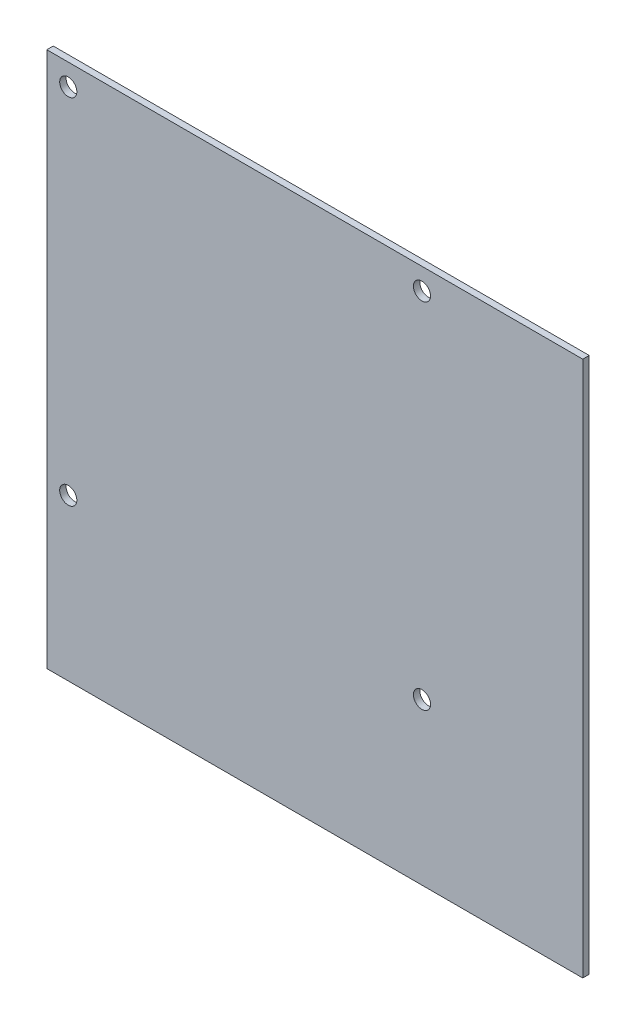
ISO-10303-21;
HEADER;
FILE_DESCRIPTION(('STEP AP214'),'2;1');
FILE_NAME('part.step','',(''),(''),'','','');
FILE_SCHEMA(('AUTOMOTIVE_DESIGN { 1 0 10303 214 1 1 1 1 }'));
ENDSEC;
DATA;
#1=APPLICATION_CONTEXT('core data for automotive mechanical design processes');
#2=APPLICATION_PROTOCOL_DEFINITION('international standard','automotive_design',2000,#1);
#3=PRODUCT_CONTEXT('',#1,'mechanical');
#4=PRODUCT('Part','Part','',(#3));
#5=PRODUCT_RELATED_PRODUCT_CATEGORY('part','',(#4));
#6=PRODUCT_DEFINITION_FORMATION('','',#4);
#7=PRODUCT_DEFINITION_CONTEXT('part definition',#1,'design');
#8=PRODUCT_DEFINITION('design','',#6,#7);
#9=PRODUCT_DEFINITION_SHAPE('','',#8);
#10=(LENGTH_UNIT() NAMED_UNIT(*) SI_UNIT(.MILLI.,.METRE.));
#11=(NAMED_UNIT(*) PLANE_ANGLE_UNIT() SI_UNIT($,.RADIAN.));
#12=(NAMED_UNIT(*) SI_UNIT($,.STERADIAN.) SOLID_ANGLE_UNIT());
#13=UNCERTAINTY_MEASURE_WITH_UNIT(LENGTH_MEASURE(1.E-05),#10,'distance_accuracy_value','');
#14=(GEOMETRIC_REPRESENTATION_CONTEXT(3) GLOBAL_UNCERTAINTY_ASSIGNED_CONTEXT((#13)) GLOBAL_UNIT_ASSIGNED_CONTEXT((#10,
#11,#12)) REPRESENTATION_CONTEXT('',''));
#15=CARTESIAN_POINT('',(0.,0.,0.));
#16=DIRECTION('',(0.,0.,1.));
#17=DIRECTION('',(1.,0.,0.));
#18=AXIS2_PLACEMENT_3D('',#15,#16,#17);
#19=CARTESIAN_POINT('',(125.,125.,2.99999999999989));
#20=DIRECTION('',(-1.,0.,0.));
#21=DIRECTION('',(0.,-1.,0.));
#22=AXIS2_PLACEMENT_3D('',#19,#20,#21);
#23=PLANE('',#22);
#24=DIRECTION('',(0.,1.,0.));
#25=VECTOR('',#24,1.);
#26=CARTESIAN_POINT('',(125.,125.,-1.11022302462516E-13));
#27=LINE('',#26,#25);
#28=CARTESIAN_POINT('',(125.,-125.,0.));
#29=VERTEX_POINT('',#28);
#30=CARTESIAN_POINT('',(125.,125.,-1.11022302462516E-13));
#31=VERTEX_POINT('',#30);
#32=EDGE_CURVE('E110',#29,#31,#27,.T.);
#33=ORIENTED_EDGE('',*,*,#32,.T.);
#34=DIRECTION('',(0.,0.,-1.));
#35=VECTOR('',#34,1.);
#36=CARTESIAN_POINT('',(125.,125.,2.99999999999989));
#37=LINE('',#36,#35);
#38=CARTESIAN_POINT('',(125.,125.,2.99999999999989));
#39=VERTEX_POINT('',#38);
#40=EDGE_CURVE('E13',#39,#31,#37,.T.);
#41=ORIENTED_EDGE('',*,*,#40,.F.);
#42=DIRECTION('',(0.,1.,0.));
#43=VECTOR('',#42,1.);
#44=CARTESIAN_POINT('',(125.,125.,2.99999999999989));
#45=LINE('',#44,#43);
#46=CARTESIAN_POINT('',(125.,-125.,2.99999999999995));
#47=VERTEX_POINT('',#46);
#48=EDGE_CURVE('E98',#47,#39,#45,.T.);
#49=ORIENTED_EDGE('',*,*,#48,.F.);
#50=DIRECTION('',(0.,0.,-1.));
#51=VECTOR('',#50,1.);
#52=CARTESIAN_POINT('',(125.,-125.,2.99999999999995));
#53=LINE('',#52,#51);
#54=EDGE_CURVE('E106',#47,#29,#53,.T.);
#55=ORIENTED_EDGE('',*,*,#54,.T.);
#56=EDGE_LOOP('',(#33,#41,#49,#55));
#57=FACE_BOUND('',#56,.T.);
#58=ADVANCED_FACE('F47',(#57),#23,.F.);
#59=CARTESIAN_POINT('',(-125.,125.,2.99999999999978));
#60=DIRECTION('',(0.,-1.,0.));
#61=DIRECTION('',(0.,0.,-1.));
#62=AXIS2_PLACEMENT_3D('',#59,#60,#61);
#63=PLANE('',#62);
#64=DIRECTION('',(-1.,0.,0.));
#65=VECTOR('',#64,1.);
#66=CARTESIAN_POINT('',(-125.,125.,-2.22044604925031E-13));
#67=LINE('',#66,#65);
#68=CARTESIAN_POINT('',(-125.,125.,-2.22044604925031E-13));
#69=VERTEX_POINT('',#68);
#70=EDGE_CURVE('E102',#31,#69,#67,.T.);
#71=ORIENTED_EDGE('',*,*,#70,.T.);
#72=DIRECTION('',(0.,0.,-1.));
#73=VECTOR('',#72,1.);
#74=CARTESIAN_POINT('',(-125.,125.,2.99999999999978));
#75=LINE('',#74,#73);
#76=CARTESIAN_POINT('',(-125.,125.,2.99999999999978));
#77=VERTEX_POINT('',#76);
#78=EDGE_CURVE('E55',#77,#69,#75,.T.);
#79=ORIENTED_EDGE('',*,*,#78,.F.);
#80=DIRECTION('',(-1.,0.,0.));
#81=VECTOR('',#80,1.);
#82=CARTESIAN_POINT('',(-125.,125.,2.99999999999978));
#83=LINE('',#82,#81);
#84=EDGE_CURVE('E93',#39,#77,#83,.T.);
#85=ORIENTED_EDGE('',*,*,#84,.F.);
#86=ORIENTED_EDGE('',*,*,#40,.T.);
#87=EDGE_LOOP('',(#71,#79,#85,#86));
#88=FACE_BOUND('',#87,.T.);
#89=ADVANCED_FACE('F101',(#88),#63,.F.);
#90=CARTESIAN_POINT('',(-125.,125.,2.99999999999978));
#91=DIRECTION('',(1.,0.,0.));
#92=DIRECTION('',(0.,1.,0.));
#93=AXIS2_PLACEMENT_3D('',#90,#91,#92);
#94=PLANE('',#93);
#95=DIRECTION('',(0.,-1.,0.));
#96=VECTOR('',#95,1.);
#97=CARTESIAN_POINT('',(-125.,125.,-2.22044604925031E-13));
#98=LINE('',#97,#96);
#99=CARTESIAN_POINT('',(-125.,-125.,-1.66533453693773E-13));
#100=VERTEX_POINT('',#99);
#101=EDGE_CURVE('E80',#69,#100,#98,.T.);
#102=ORIENTED_EDGE('',*,*,#101,.T.);
#103=DIRECTION('',(0.,0.,-1.));
#104=VECTOR('',#103,1.);
#105=CARTESIAN_POINT('',(-125.,-125.,2.99999999999984));
#106=LINE('',#105,#104);
#107=CARTESIAN_POINT('',(-125.,-125.,2.99999999999984));
#108=VERTEX_POINT('',#107);
#109=EDGE_CURVE('E103',#108,#100,#106,.T.);
#110=ORIENTED_EDGE('',*,*,#109,.F.);
#111=DIRECTION('',(0.,-1.,0.));
#112=VECTOR('',#111,1.);
#113=CARTESIAN_POINT('',(-125.,125.,2.99999999999978));
#114=LINE('',#113,#112);
#115=EDGE_CURVE('E96',#77,#108,#114,.T.);
#116=ORIENTED_EDGE('',*,*,#115,.F.);
#117=ORIENTED_EDGE('',*,*,#78,.T.);
#118=EDGE_LOOP('',(#102,#110,#116,#117));
#119=FACE_BOUND('',#118,.T.);
#120=ADVANCED_FACE('F104',(#119),#94,.F.);
#121=CARTESIAN_POINT('',(-125.,-125.,2.99999999999984));
#122=DIRECTION('',(0.,1.,0.));
#123=DIRECTION('',(0.,0.,1.));
#124=AXIS2_PLACEMENT_3D('',#121,#122,#123);
#125=PLANE('',#124);
#126=DIRECTION('',(1.,0.,0.));
#127=VECTOR('',#126,1.);
#128=CARTESIAN_POINT('',(-125.,-125.,-1.66533453693773E-13));
#129=LINE('',#128,#127);
#130=EDGE_CURVE('E86',#100,#29,#129,.T.);
#131=ORIENTED_EDGE('',*,*,#130,.T.);
#132=ORIENTED_EDGE('',*,*,#54,.F.);
#133=DIRECTION('',(1.,0.,0.));
#134=VECTOR('',#133,1.);
#135=CARTESIAN_POINT('',(-125.,-125.,2.99999999999984));
#136=LINE('',#135,#134);
#137=EDGE_CURVE('E63',#108,#47,#136,.T.);
#138=ORIENTED_EDGE('',*,*,#137,.F.);
#139=ORIENTED_EDGE('',*,*,#109,.T.);
#140=EDGE_LOOP('',(#131,#132,#138,#139));
#141=FACE_BOUND('',#140,.T.);
#142=ADVANCED_FACE('F118',(#141),#125,.F.);
#143=CARTESIAN_POINT('',(0.,0.,3.));
#144=DIRECTION('',(0.,0.,1.));
#145=DIRECTION('',(1.,0.,0.));
#146=AXIS2_PLACEMENT_3D('',#143,#144,#145);
#147=PLANE('',#146);
#148=CARTESIAN_POINT('',(50.,115.,2.99999999999989));
#149=DIRECTION('',(0.,0.,1.));
#150=DIRECTION('',(1.,0.,0.));
#151=AXIS2_PLACEMENT_3D('',#148,#149,#150);
#152=CIRCLE('',#151,4.00000000000001);
#153=CARTESIAN_POINT('',(54.,115.,2.99999999999989));
#154=VERTEX_POINT('',#153);
#155=EDGE_CURVE('E137',#154,#154,#152,.T.);
#156=ORIENTED_EDGE('',*,*,#155,.F.);
#157=EDGE_LOOP('',(#156));
#158=FACE_BOUND('',#157,.T.);
#159=CARTESIAN_POINT('',(-115.,-50.,2.99999999999995));
#160=DIRECTION('',(0.,0.,1.));
#161=DIRECTION('',(1.,0.,0.));
#162=AXIS2_PLACEMENT_3D('',#159,#160,#161);
#163=CIRCLE('',#162,4.00000000000001);
#164=CARTESIAN_POINT('',(-111.,-50.,2.99999999999995));
#165=VERTEX_POINT('',#164);
#166=EDGE_CURVE('E130',#165,#165,#163,.T.);
#167=ORIENTED_EDGE('',*,*,#166,.F.);
#168=EDGE_LOOP('',(#167));
#169=FACE_BOUND('',#168,.T.);
#170=CARTESIAN_POINT('',(50.,-50.,2.99999999999989));
#171=DIRECTION('',(0.,0.,1.));
#172=DIRECTION('',(1.,0.,0.));
#173=AXIS2_PLACEMENT_3D('',#170,#171,#172);
#174=CIRCLE('',#173,4.00000000000001);
#175=CARTESIAN_POINT('',(54.,-50.,2.99999999999989));
#176=VERTEX_POINT('',#175);
#177=EDGE_CURVE('E142',#176,#176,#174,.T.);
#178=ORIENTED_EDGE('',*,*,#177,.F.);
#179=EDGE_LOOP('',(#178));
#180=FACE_BOUND('',#179,.T.);
#181=CARTESIAN_POINT('',(-115.,115.,2.99999999999995));
#182=DIRECTION('',(0.,0.,1.));
#183=DIRECTION('',(1.,0.,0.));
#184=AXIS2_PLACEMENT_3D('',#181,#182,#183);
#185=CIRCLE('',#184,4.00000000000001);
#186=CARTESIAN_POINT('',(-111.,115.,2.99999999999995));
#187=VERTEX_POINT('',#186);
#188=EDGE_CURVE('E124',#187,#187,#185,.T.);
#189=ORIENTED_EDGE('',*,*,#188,.F.);
#190=EDGE_LOOP('',(#189));
#191=FACE_BOUND('',#190,.T.);
#192=ORIENTED_EDGE('',*,*,#48,.T.);
#193=ORIENTED_EDGE('',*,*,#84,.T.);
#194=ORIENTED_EDGE('',*,*,#115,.T.);
#195=ORIENTED_EDGE('',*,*,#137,.T.);
#196=EDGE_LOOP('',(#192,#193,#194,#195));
#197=FACE_BOUND('',#196,.T.);
#198=ADVANCED_FACE('F94',(#158,#169,#180,#191,#197),#147,.T.);
#199=CARTESIAN_POINT('',(0.,0.,0.));
#200=DIRECTION('',(0.,0.,1.));
#201=DIRECTION('',(1.,0.,0.));
#202=AXIS2_PLACEMENT_3D('',#199,#200,#201);
#203=PLANE('',#202);
#204=CARTESIAN_POINT('',(50.,115.,-1.11022302462516E-13));
#205=DIRECTION('',(0.,0.,1.));
#206=DIRECTION('',(1.,0.,0.));
#207=AXIS2_PLACEMENT_3D('',#204,#205,#206);
#208=CIRCLE('',#207,4.00000000000001);
#209=CARTESIAN_POINT('',(54.,115.,-1.11022302468927E-13));
#210=VERTEX_POINT('',#209);
#211=EDGE_CURVE('E127',#210,#210,#208,.T.);
#212=ORIENTED_EDGE('',*,*,#211,.T.);
#213=EDGE_LOOP('',(#212));
#214=FACE_BOUND('',#213,.T.);
#215=CARTESIAN_POINT('',(-115.,-50.,0.));
#216=DIRECTION('',(0.,0.,1.));
#217=DIRECTION('',(1.,0.,0.));
#218=AXIS2_PLACEMENT_3D('',#215,#216,#217);
#219=CIRCLE('',#218,4.00000000000001);
#220=CARTESIAN_POINT('',(-111.,-50.,0.));
#221=VERTEX_POINT('',#220);
#222=EDGE_CURVE('E133',#221,#221,#219,.T.);
#223=ORIENTED_EDGE('',*,*,#222,.T.);
#224=EDGE_LOOP('',(#223));
#225=FACE_BOUND('',#224,.T.);
#226=CARTESIAN_POINT('',(50.,-50.,-1.11022302462516E-13));
#227=DIRECTION('',(0.,0.,1.));
#228=DIRECTION('',(1.,0.,0.));
#229=AXIS2_PLACEMENT_3D('',#226,#227,#228);
#230=CIRCLE('',#229,4.00000000000001);
#231=CARTESIAN_POINT('',(54.,-50.,-1.11022302468927E-13));
#232=VERTEX_POINT('',#231);
#233=EDGE_CURVE('E134',#232,#232,#230,.T.);
#234=ORIENTED_EDGE('',*,*,#233,.T.);
#235=EDGE_LOOP('',(#234));
#236=FACE_BOUND('',#235,.T.);
#237=CARTESIAN_POINT('',(-115.,115.,0.));
#238=DIRECTION('',(0.,0.,1.));
#239=DIRECTION('',(1.,0.,0.));
#240=AXIS2_PLACEMENT_3D('',#237,#238,#239);
#241=CIRCLE('',#240,4.00000000000001);
#242=CARTESIAN_POINT('',(-111.,115.,0.));
#243=VERTEX_POINT('',#242);
#244=EDGE_CURVE('E113',#243,#243,#241,.T.);
#245=ORIENTED_EDGE('',*,*,#244,.T.);
#246=EDGE_LOOP('',(#245));
#247=FACE_BOUND('',#246,.T.);
#248=ORIENTED_EDGE('',*,*,#32,.F.);
#249=ORIENTED_EDGE('',*,*,#130,.F.);
#250=ORIENTED_EDGE('',*,*,#101,.F.);
#251=ORIENTED_EDGE('',*,*,#70,.F.);
#252=EDGE_LOOP('',(#248,#249,#250,#251));
#253=FACE_BOUND('',#252,.T.);
#254=ADVANCED_FACE('F121',(#214,#225,#236,#247,#253),#203,.F.);
#255=CARTESIAN_POINT('',(-115.,115.,0.));
#256=DIRECTION('',(0.,0.,1.));
#257=DIRECTION('',(1.,0.,0.));
#258=AXIS2_PLACEMENT_3D('',#255,#256,#257);
#259=CYLINDRICAL_SURFACE('',#258,4.00000000000001);
#260=CARTESIAN_POINT('',(-111.,115.,0.));
#261=CARTESIAN_POINT('',(-111.,115.,0.0312499999999446));
#262=CARTESIAN_POINT('',(-111.,115.,0.0624999999999446));
#263=CARTESIAN_POINT('',(-111.,115.,0.124999999999945));
#264=CARTESIAN_POINT('',(-111.,115.,0.156249999999945));
#265=CARTESIAN_POINT('',(-111.,115.,0.218749999999945));
#266=CARTESIAN_POINT('',(-111.,115.,0.249999999999945));
#267=CARTESIAN_POINT('',(-111.,115.,0.312499999999945));
#268=CARTESIAN_POINT('',(-111.,115.,0.343749999999945));
#269=CARTESIAN_POINT('',(-111.,115.,0.406249999999945));
#270=CARTESIAN_POINT('',(-111.,115.,0.437499999999945));
#271=CARTESIAN_POINT('',(-111.,115.,0.499999999999945));
#272=CARTESIAN_POINT('',(-111.,115.,0.531249999999945));
#273=CARTESIAN_POINT('',(-111.,115.,0.593749999999945));
#274=CARTESIAN_POINT('',(-111.,115.,0.624999999999945));
#275=CARTESIAN_POINT('',(-111.,115.,0.687499999999945));
#276=CARTESIAN_POINT('',(-111.,115.,0.718749999999945));
#277=CARTESIAN_POINT('',(-111.,115.,0.781249999999945));
#278=CARTESIAN_POINT('',(-111.,115.,0.812499999999945));
#279=CARTESIAN_POINT('',(-111.,115.,0.874999999999945));
#280=CARTESIAN_POINT('',(-111.,115.,0.906249999999945));
#281=CARTESIAN_POINT('',(-111.,115.,0.968749999999945));
#282=CARTESIAN_POINT('',(-111.,115.,0.999999999999945));
#283=CARTESIAN_POINT('',(-111.,115.,1.06249999999995));
#284=CARTESIAN_POINT('',(-111.,115.,1.09374999999995));
#285=CARTESIAN_POINT('',(-111.,115.,1.15624999999995));
#286=CARTESIAN_POINT('',(-111.,115.,1.18749999999995));
#287=CARTESIAN_POINT('',(-111.,115.,1.24999999999995));
#288=CARTESIAN_POINT('',(-111.,115.,1.28124999999995));
#289=CARTESIAN_POINT('',(-111.,115.,1.34374999999995));
#290=CARTESIAN_POINT('',(-111.,115.,1.37499999999995));
#291=CARTESIAN_POINT('',(-111.,115.,1.43749999999995));
#292=CARTESIAN_POINT('',(-111.,115.,1.46874999999995));
#293=CARTESIAN_POINT('',(-111.,115.,1.53124999999995));
#294=CARTESIAN_POINT('',(-111.,115.,1.56249999999995));
#295=CARTESIAN_POINT('',(-111.,115.,1.62499999999995));
#296=CARTESIAN_POINT('',(-111.,115.,1.65624999999995));
#297=CARTESIAN_POINT('',(-111.,115.,1.71874999999995));
#298=CARTESIAN_POINT('',(-111.,115.,1.74999999999995));
#299=CARTESIAN_POINT('',(-111.,115.,1.81249999999995));
#300=CARTESIAN_POINT('',(-111.,115.,1.84374999999995));
#301=CARTESIAN_POINT('',(-111.,115.,1.90624999999995));
#302=CARTESIAN_POINT('',(-111.,115.,1.93749999999995));
#303=CARTESIAN_POINT('',(-111.,115.,1.99999999999995));
#304=CARTESIAN_POINT('',(-111.,115.,2.03124999999995));
#305=CARTESIAN_POINT('',(-111.,115.,2.09374999999995));
#306=CARTESIAN_POINT('',(-111.,115.,2.12499999999995));
#307=CARTESIAN_POINT('',(-111.,115.,2.18749999999995));
#308=CARTESIAN_POINT('',(-111.,115.,2.21874999999995));
#309=CARTESIAN_POINT('',(-111.,115.,2.28124999999995));
#310=CARTESIAN_POINT('',(-111.,115.,2.31249999999995));
#311=CARTESIAN_POINT('',(-111.,115.,2.37499999999995));
#312=CARTESIAN_POINT('',(-111.,115.,2.40624999999995));
#313=CARTESIAN_POINT('',(-111.,115.,2.46874999999995));
#314=CARTESIAN_POINT('',(-111.,115.,2.49999999999995));
#315=CARTESIAN_POINT('',(-111.,115.,2.56249999999995));
#316=CARTESIAN_POINT('',(-111.,115.,2.59374999999995));
#317=CARTESIAN_POINT('',(-111.,115.,2.65624999999995));
#318=CARTESIAN_POINT('',(-111.,115.,2.68749999999995));
#319=CARTESIAN_POINT('',(-111.,115.,2.74999999999995));
#320=CARTESIAN_POINT('',(-111.,115.,2.78124999999995));
#321=CARTESIAN_POINT('',(-111.,115.,2.84374999999995));
#322=CARTESIAN_POINT('',(-111.,115.,2.87499999999995));
#323=CARTESIAN_POINT('',(-111.,115.,2.93749999999995));
#324=CARTESIAN_POINT('',(-111.,115.,2.96874999999995));
#325=CARTESIAN_POINT('',(-111.,115.,2.99999999999995));
#326=B_SPLINE_CURVE_WITH_KNOTS('',3,(#260,#261,#262,#263,#264,#265,#266,#267,#268,#269,#270,
#271,#272,#273,#274,#275,#276,#277,#278,#279,#280,#281,#282,#283,#284,#285,#286,#287,#288,#289,
#290,#291,#292,#293,#294,#295,#296,#297,#298,#299,#300,#301,#302,#303,#304,#305,#306,#307,#308,
#309,#310,#311,#312,#313,#314,#315,#316,#317,#318,#319,#320,#321,#322,#323,#324,#325),
.UNSPECIFIED.,.F.,.F.,(4,2,2,2,2,2,2,2,2,2,2,2,2,2,2,2,2,2,2,2,2,2,2,2,2,2,2,2,2,2,2,2,4),(0.,
0.0937500000000001,0.1875,0.28125,0.375,0.46875,0.5625,0.65625,0.750000000000001,
0.843750000000001,0.937500000000001,1.03125,1.125,1.21875,1.3125,1.40625,1.5,1.59375,1.6875,
1.78125,1.875,1.96875,2.0625,2.15625,2.25,2.34375,2.4375,2.53125,2.625,2.71875,2.8125,2.90625,
3.),.UNSPECIFIED.);
#327=EDGE_CURVE('BSEAM154',#243,#187,#326,.T.);
#328=ORIENTED_EDGE('',*,*,#244,.F.);
#329=ORIENTED_EDGE('',*,*,#188,.T.);
#330=ORIENTED_EDGE('',*,*,#327,.T.);
#331=ORIENTED_EDGE('',*,*,#327,.F.);
#332=EDGE_LOOP('',(#328,#330,#329,#331));
#333=FACE_BOUND('',#332,.T.);
#334=ADVANCED_FACE('F154',(#333),#259,.F.);
#335=CARTESIAN_POINT('',(50.,-50.,-1.11022302462516E-13));
#336=DIRECTION('',(0.,0.,1.));
#337=DIRECTION('',(1.,0.,0.));
#338=AXIS2_PLACEMENT_3D('',#335,#336,#337);
#339=CYLINDRICAL_SURFACE('',#338,4.00000000000001);
#340=CARTESIAN_POINT('',(54.,-50.,-1.11022302468927E-13));
#341=CARTESIAN_POINT('',(54.,-50.,0.031249999999889));
#342=CARTESIAN_POINT('',(54.,-50.,0.062499999999889));
#343=CARTESIAN_POINT('',(54.,-50.,0.124999999999889));
#344=CARTESIAN_POINT('',(54.,-50.,0.156249999999889));
#345=CARTESIAN_POINT('',(54.,-50.,0.218749999999889));
#346=CARTESIAN_POINT('',(54.,-50.,0.249999999999889));
#347=CARTESIAN_POINT('',(54.,-50.,0.312499999999889));
#348=CARTESIAN_POINT('',(54.,-50.,0.343749999999889));
#349=CARTESIAN_POINT('',(54.,-50.,0.406249999999889));
#350=CARTESIAN_POINT('',(54.,-50.,0.437499999999889));
#351=CARTESIAN_POINT('',(54.,-50.,0.499999999999889));
#352=CARTESIAN_POINT('',(54.,-50.,0.531249999999889));
#353=CARTESIAN_POINT('',(54.,-50.,0.59374999999989));
#354=CARTESIAN_POINT('',(54.,-50.,0.624999999999889));
#355=CARTESIAN_POINT('',(54.,-50.,0.68749999999989));
#356=CARTESIAN_POINT('',(54.,-50.,0.71874999999989));
#357=CARTESIAN_POINT('',(54.,-50.,0.78124999999989));
#358=CARTESIAN_POINT('',(54.,-50.,0.81249999999989));
#359=CARTESIAN_POINT('',(54.,-50.,0.87499999999989));
#360=CARTESIAN_POINT('',(54.,-50.,0.90624999999989));
#361=CARTESIAN_POINT('',(54.,-50.,0.96874999999989));
#362=CARTESIAN_POINT('',(54.,-50.,0.99999999999989));
#363=CARTESIAN_POINT('',(54.,-50.,1.06249999999989));
#364=CARTESIAN_POINT('',(54.,-50.,1.09374999999989));
#365=CARTESIAN_POINT('',(54.,-50.,1.15624999999989));
#366=CARTESIAN_POINT('',(54.,-50.,1.18749999999989));
#367=CARTESIAN_POINT('',(54.,-50.,1.24999999999989));
#368=CARTESIAN_POINT('',(54.,-50.,1.28124999999989));
#369=CARTESIAN_POINT('',(54.,-50.,1.34374999999989));
#370=CARTESIAN_POINT('',(54.,-50.,1.37499999999989));
#371=CARTESIAN_POINT('',(54.,-50.,1.43749999999989));
#372=CARTESIAN_POINT('',(54.,-50.,1.46874999999989));
#373=CARTESIAN_POINT('',(54.,-50.,1.53124999999989));
#374=CARTESIAN_POINT('',(54.,-50.,1.56249999999989));
#375=CARTESIAN_POINT('',(54.,-50.,1.62499999999989));
#376=CARTESIAN_POINT('',(54.,-50.,1.65624999999989));
#377=CARTESIAN_POINT('',(54.,-50.,1.71874999999989));
#378=CARTESIAN_POINT('',(54.,-50.,1.74999999999989));
#379=CARTESIAN_POINT('',(54.,-50.,1.81249999999989));
#380=CARTESIAN_POINT('',(54.,-50.,1.84374999999989));
#381=CARTESIAN_POINT('',(54.,-50.,1.90624999999989));
#382=CARTESIAN_POINT('',(54.,-50.,1.93749999999989));
#383=CARTESIAN_POINT('',(54.,-50.,1.99999999999989));
#384=CARTESIAN_POINT('',(54.,-50.,2.03124999999989));
#385=CARTESIAN_POINT('',(54.,-50.,2.09374999999989));
#386=CARTESIAN_POINT('',(54.,-50.,2.12499999999989));
#387=CARTESIAN_POINT('',(54.,-50.,2.18749999999989));
#388=CARTESIAN_POINT('',(54.,-50.,2.21874999999989));
#389=CARTESIAN_POINT('',(54.,-50.,2.28124999999989));
#390=CARTESIAN_POINT('',(54.,-50.,2.31249999999989));
#391=CARTESIAN_POINT('',(54.,-50.,2.37499999999989));
#392=CARTESIAN_POINT('',(54.,-50.,2.40624999999989));
#393=CARTESIAN_POINT('',(54.,-50.,2.46874999999989));
#394=CARTESIAN_POINT('',(54.,-50.,2.49999999999989));
#395=CARTESIAN_POINT('',(54.,-50.,2.56249999999989));
#396=CARTESIAN_POINT('',(54.,-50.,2.59374999999989));
#397=CARTESIAN_POINT('',(54.,-50.,2.65624999999989));
#398=CARTESIAN_POINT('',(54.,-50.,2.68749999999989));
#399=CARTESIAN_POINT('',(54.,-50.,2.74999999999989));
#400=CARTESIAN_POINT('',(54.,-50.,2.78124999999989));
#401=CARTESIAN_POINT('',(54.,-50.,2.84374999999989));
#402=CARTESIAN_POINT('',(54.,-50.,2.87499999999989));
#403=CARTESIAN_POINT('',(54.,-50.,2.93749999999989));
#404=CARTESIAN_POINT('',(54.,-50.,2.96874999999989));
#405=CARTESIAN_POINT('',(54.,-50.,2.99999999999989));
#406=B_SPLINE_CURVE_WITH_KNOTS('',3,(#340,#341,#342,#343,#344,#345,#346,#347,#348,#349,#350,
#351,#352,#353,#354,#355,#356,#357,#358,#359,#360,#361,#362,#363,#364,#365,#366,#367,#368,#369,
#370,#371,#372,#373,#374,#375,#376,#377,#378,#379,#380,#381,#382,#383,#384,#385,#386,#387,#388,
#389,#390,#391,#392,#393,#394,#395,#396,#397,#398,#399,#400,#401,#402,#403,#404,#405),
.UNSPECIFIED.,.F.,.F.,(4,2,2,2,2,2,2,2,2,2,2,2,2,2,2,2,2,2,2,2,2,2,2,2,2,2,2,2,2,2,2,2,4),(0.,
0.0937500000000001,0.1875,0.28125,0.375,0.46875,0.5625,0.65625,0.750000000000001,
0.843750000000001,0.937500000000001,1.03125,1.125,1.21875,1.3125,1.40625,1.5,1.59375,1.6875,
1.78125,1.875,1.96875,2.0625,2.15625,2.25,2.34375,2.4375,2.53125,2.625,2.71875,2.8125,2.90625,
3.),.UNSPECIFIED.);
#407=EDGE_CURVE('BSEAM150',#232,#176,#406,.T.);
#408=ORIENTED_EDGE('',*,*,#233,.F.);
#409=ORIENTED_EDGE('',*,*,#177,.T.);
#410=ORIENTED_EDGE('',*,*,#407,.T.);
#411=ORIENTED_EDGE('',*,*,#407,.F.);
#412=EDGE_LOOP('',(#408,#410,#409,#411));
#413=FACE_BOUND('',#412,.T.);
#414=ADVANCED_FACE('F150',(#413),#339,.F.);
#415=CARTESIAN_POINT('',(-115.,-50.,0.));
#416=DIRECTION('',(0.,0.,1.));
#417=DIRECTION('',(1.,0.,0.));
#418=AXIS2_PLACEMENT_3D('',#415,#416,#417);
#419=CYLINDRICAL_SURFACE('',#418,4.00000000000001);
#420=CARTESIAN_POINT('',(-111.,-50.,0.));
#421=CARTESIAN_POINT('',(-111.,-50.,0.0312499999999446));
#422=CARTESIAN_POINT('',(-111.,-50.,0.0624999999999446));
#423=CARTESIAN_POINT('',(-111.,-50.,0.124999999999945));
#424=CARTESIAN_POINT('',(-111.,-50.,0.156249999999945));
#425=CARTESIAN_POINT('',(-111.,-50.,0.218749999999945));
#426=CARTESIAN_POINT('',(-111.,-50.,0.249999999999945));
#427=CARTESIAN_POINT('',(-111.,-50.,0.312499999999945));
#428=CARTESIAN_POINT('',(-111.,-50.,0.343749999999945));
#429=CARTESIAN_POINT('',(-111.,-50.,0.406249999999945));
#430=CARTESIAN_POINT('',(-111.,-50.,0.437499999999945));
#431=CARTESIAN_POINT('',(-111.,-50.,0.499999999999945));
#432=CARTESIAN_POINT('',(-111.,-50.,0.531249999999945));
#433=CARTESIAN_POINT('',(-111.,-50.,0.593749999999945));
#434=CARTESIAN_POINT('',(-111.,-50.,0.624999999999945));
#435=CARTESIAN_POINT('',(-111.,-50.,0.687499999999945));
#436=CARTESIAN_POINT('',(-111.,-50.,0.718749999999945));
#437=CARTESIAN_POINT('',(-111.,-50.,0.781249999999945));
#438=CARTESIAN_POINT('',(-111.,-50.,0.812499999999945));
#439=CARTESIAN_POINT('',(-111.,-50.,0.874999999999945));
#440=CARTESIAN_POINT('',(-111.,-50.,0.906249999999945));
#441=CARTESIAN_POINT('',(-111.,-50.,0.968749999999945));
#442=CARTESIAN_POINT('',(-111.,-50.,0.999999999999945));
#443=CARTESIAN_POINT('',(-111.,-50.,1.06249999999995));
#444=CARTESIAN_POINT('',(-111.,-50.,1.09374999999995));
#445=CARTESIAN_POINT('',(-111.,-50.,1.15624999999995));
#446=CARTESIAN_POINT('',(-111.,-50.,1.18749999999995));
#447=CARTESIAN_POINT('',(-111.,-50.,1.24999999999995));
#448=CARTESIAN_POINT('',(-111.,-50.,1.28124999999995));
#449=CARTESIAN_POINT('',(-111.,-50.,1.34374999999995));
#450=CARTESIAN_POINT('',(-111.,-50.,1.37499999999995));
#451=CARTESIAN_POINT('',(-111.,-50.,1.43749999999995));
#452=CARTESIAN_POINT('',(-111.,-50.,1.46874999999995));
#453=CARTESIAN_POINT('',(-111.,-50.,1.53124999999995));
#454=CARTESIAN_POINT('',(-111.,-50.,1.56249999999995));
#455=CARTESIAN_POINT('',(-111.,-50.,1.62499999999995));
#456=CARTESIAN_POINT('',(-111.,-50.,1.65624999999995));
#457=CARTESIAN_POINT('',(-111.,-50.,1.71874999999995));
#458=CARTESIAN_POINT('',(-111.,-50.,1.74999999999995));
#459=CARTESIAN_POINT('',(-111.,-50.,1.81249999999995));
#460=CARTESIAN_POINT('',(-111.,-50.,1.84374999999995));
#461=CARTESIAN_POINT('',(-111.,-50.,1.90624999999995));
#462=CARTESIAN_POINT('',(-111.,-50.,1.93749999999995));
#463=CARTESIAN_POINT('',(-111.,-50.,1.99999999999995));
#464=CARTESIAN_POINT('',(-111.,-50.,2.03124999999995));
#465=CARTESIAN_POINT('',(-111.,-50.,2.09374999999995));
#466=CARTESIAN_POINT('',(-111.,-50.,2.12499999999995));
#467=CARTESIAN_POINT('',(-111.,-50.,2.18749999999995));
#468=CARTESIAN_POINT('',(-111.,-50.,2.21874999999995));
#469=CARTESIAN_POINT('',(-111.,-50.,2.28124999999995));
#470=CARTESIAN_POINT('',(-111.,-50.,2.31249999999995));
#471=CARTESIAN_POINT('',(-111.,-50.,2.37499999999995));
#472=CARTESIAN_POINT('',(-111.,-50.,2.40624999999995));
#473=CARTESIAN_POINT('',(-111.,-50.,2.46874999999995));
#474=CARTESIAN_POINT('',(-111.,-50.,2.49999999999995));
#475=CARTESIAN_POINT('',(-111.,-50.,2.56249999999995));
#476=CARTESIAN_POINT('',(-111.,-50.,2.59374999999995));
#477=CARTESIAN_POINT('',(-111.,-50.,2.65624999999995));
#478=CARTESIAN_POINT('',(-111.,-50.,2.68749999999995));
#479=CARTESIAN_POINT('',(-111.,-50.,2.74999999999995));
#480=CARTESIAN_POINT('',(-111.,-50.,2.78124999999995));
#481=CARTESIAN_POINT('',(-111.,-50.,2.84374999999995));
#482=CARTESIAN_POINT('',(-111.,-50.,2.87499999999995));
#483=CARTESIAN_POINT('',(-111.,-50.,2.93749999999995));
#484=CARTESIAN_POINT('',(-111.,-50.,2.96874999999995));
#485=CARTESIAN_POINT('',(-111.,-50.,2.99999999999995));
#486=B_SPLINE_CURVE_WITH_KNOTS('',3,(#420,#421,#422,#423,#424,#425,#426,#427,#428,#429,#430,
#431,#432,#433,#434,#435,#436,#437,#438,#439,#440,#441,#442,#443,#444,#445,#446,#447,#448,#449,
#450,#451,#452,#453,#454,#455,#456,#457,#458,#459,#460,#461,#462,#463,#464,#465,#466,#467,#468,
#469,#470,#471,#472,#473,#474,#475,#476,#477,#478,#479,#480,#481,#482,#483,#484,#485),
.UNSPECIFIED.,.F.,.F.,(4,2,2,2,2,2,2,2,2,2,2,2,2,2,2,2,2,2,2,2,2,2,2,2,2,2,2,2,2,2,2,2,4),(0.,
0.0937500000000001,0.1875,0.28125,0.375,0.46875,0.5625,0.65625,0.750000000000001,
0.843750000000001,0.937500000000001,1.03125,1.125,1.21875,1.3125,1.40625,1.5,1.59375,1.6875,
1.78125,1.875,1.96875,2.0625,2.15625,2.25,2.34375,2.4375,2.53125,2.625,2.71875,2.8125,2.90625,
3.),.UNSPECIFIED.);
#487=EDGE_CURVE('BSEAM153',#221,#165,#486,.T.);
#488=ORIENTED_EDGE('',*,*,#222,.F.);
#489=ORIENTED_EDGE('',*,*,#166,.T.);
#490=ORIENTED_EDGE('',*,*,#487,.T.);
#491=ORIENTED_EDGE('',*,*,#487,.F.);
#492=EDGE_LOOP('',(#488,#490,#489,#491));
#493=FACE_BOUND('',#492,.T.);
#494=ADVANCED_FACE('F153',(#493),#419,.F.);
#495=CARTESIAN_POINT('',(50.,115.,-1.11022302462516E-13));
#496=DIRECTION('',(0.,0.,1.));
#497=DIRECTION('',(1.,0.,0.));
#498=AXIS2_PLACEMENT_3D('',#495,#496,#497);
#499=CYLINDRICAL_SURFACE('',#498,4.00000000000001);
#500=CARTESIAN_POINT('',(54.,115.,-1.11022302468927E-13));
#501=CARTESIAN_POINT('',(54.,115.,0.031249999999889));
#502=CARTESIAN_POINT('',(54.,115.,0.062499999999889));
#503=CARTESIAN_POINT('',(54.,115.,0.124999999999889));
#504=CARTESIAN_POINT('',(54.,115.,0.156249999999889));
#505=CARTESIAN_POINT('',(54.,115.,0.218749999999889));
#506=CARTESIAN_POINT('',(54.,115.,0.249999999999889));
#507=CARTESIAN_POINT('',(54.,115.,0.312499999999889));
#508=CARTESIAN_POINT('',(54.,115.,0.343749999999889));
#509=CARTESIAN_POINT('',(54.,115.,0.406249999999889));
#510=CARTESIAN_POINT('',(54.,115.,0.437499999999889));
#511=CARTESIAN_POINT('',(54.,115.,0.499999999999889));
#512=CARTESIAN_POINT('',(54.,115.,0.531249999999889));
#513=CARTESIAN_POINT('',(54.,115.,0.59374999999989));
#514=CARTESIAN_POINT('',(54.,115.,0.624999999999889));
#515=CARTESIAN_POINT('',(54.,115.,0.68749999999989));
#516=CARTESIAN_POINT('',(54.,115.,0.71874999999989));
#517=CARTESIAN_POINT('',(54.,115.,0.78124999999989));
#518=CARTESIAN_POINT('',(54.,115.,0.81249999999989));
#519=CARTESIAN_POINT('',(54.,115.,0.87499999999989));
#520=CARTESIAN_POINT('',(54.,115.,0.90624999999989));
#521=CARTESIAN_POINT('',(54.,115.,0.96874999999989));
#522=CARTESIAN_POINT('',(54.,115.,0.99999999999989));
#523=CARTESIAN_POINT('',(54.,115.,1.06249999999989));
#524=CARTESIAN_POINT('',(54.,115.,1.09374999999989));
#525=CARTESIAN_POINT('',(54.,115.,1.15624999999989));
#526=CARTESIAN_POINT('',(54.,115.,1.18749999999989));
#527=CARTESIAN_POINT('',(54.,115.,1.24999999999989));
#528=CARTESIAN_POINT('',(54.,115.,1.28124999999989));
#529=CARTESIAN_POINT('',(54.,115.,1.34374999999989));
#530=CARTESIAN_POINT('',(54.,115.,1.37499999999989));
#531=CARTESIAN_POINT('',(54.,115.,1.43749999999989));
#532=CARTESIAN_POINT('',(54.,115.,1.46874999999989));
#533=CARTESIAN_POINT('',(54.,115.,1.53124999999989));
#534=CARTESIAN_POINT('',(54.,115.,1.56249999999989));
#535=CARTESIAN_POINT('',(54.,115.,1.62499999999989));
#536=CARTESIAN_POINT('',(54.,115.,1.65624999999989));
#537=CARTESIAN_POINT('',(54.,115.,1.71874999999989));
#538=CARTESIAN_POINT('',(54.,115.,1.74999999999989));
#539=CARTESIAN_POINT('',(54.,115.,1.81249999999989));
#540=CARTESIAN_POINT('',(54.,115.,1.84374999999989));
#541=CARTESIAN_POINT('',(54.,115.,1.90624999999989));
#542=CARTESIAN_POINT('',(54.,115.,1.93749999999989));
#543=CARTESIAN_POINT('',(54.,115.,1.99999999999989));
#544=CARTESIAN_POINT('',(54.,115.,2.03124999999989));
#545=CARTESIAN_POINT('',(54.,115.,2.09374999999989));
#546=CARTESIAN_POINT('',(54.,115.,2.12499999999989));
#547=CARTESIAN_POINT('',(54.,115.,2.18749999999989));
#548=CARTESIAN_POINT('',(54.,115.,2.21874999999989));
#549=CARTESIAN_POINT('',(54.,115.,2.28124999999989));
#550=CARTESIAN_POINT('',(54.,115.,2.31249999999989));
#551=CARTESIAN_POINT('',(54.,115.,2.37499999999989));
#552=CARTESIAN_POINT('',(54.,115.,2.40624999999989));
#553=CARTESIAN_POINT('',(54.,115.,2.46874999999989));
#554=CARTESIAN_POINT('',(54.,115.,2.49999999999989));
#555=CARTESIAN_POINT('',(54.,115.,2.56249999999989));
#556=CARTESIAN_POINT('',(54.,115.,2.59374999999989));
#557=CARTESIAN_POINT('',(54.,115.,2.65624999999989));
#558=CARTESIAN_POINT('',(54.,115.,2.68749999999989));
#559=CARTESIAN_POINT('',(54.,115.,2.74999999999989));
#560=CARTESIAN_POINT('',(54.,115.,2.78124999999989));
#561=CARTESIAN_POINT('',(54.,115.,2.84374999999989));
#562=CARTESIAN_POINT('',(54.,115.,2.87499999999989));
#563=CARTESIAN_POINT('',(54.,115.,2.93749999999989));
#564=CARTESIAN_POINT('',(54.,115.,2.96874999999989));
#565=CARTESIAN_POINT('',(54.,115.,2.99999999999989));
#566=B_SPLINE_CURVE_WITH_KNOTS('',3,(#500,#501,#502,#503,#504,#505,#506,#507,#508,#509,#510,
#511,#512,#513,#514,#515,#516,#517,#518,#519,#520,#521,#522,#523,#524,#525,#526,#527,#528,#529,
#530,#531,#532,#533,#534,#535,#536,#537,#538,#539,#540,#541,#542,#543,#544,#545,#546,#547,#548,
#549,#550,#551,#552,#553,#554,#555,#556,#557,#558,#559,#560,#561,#562,#563,#564,#565),
.UNSPECIFIED.,.F.,.F.,(4,2,2,2,2,2,2,2,2,2,2,2,2,2,2,2,2,2,2,2,2,2,2,2,2,2,2,2,2,2,2,2,4),(0.,
0.0937500000000001,0.1875,0.28125,0.375,0.46875,0.5625,0.65625,0.750000000000001,
0.843750000000001,0.937500000000001,1.03125,1.125,1.21875,1.3125,1.40625,1.5,1.59375,1.6875,
1.78125,1.875,1.96875,2.0625,2.15625,2.25,2.34375,2.4375,2.53125,2.625,2.71875,2.8125,2.90625,
3.),.UNSPECIFIED.);
#567=EDGE_CURVE('BSEAM209',#210,#154,#566,.T.);
#568=ORIENTED_EDGE('',*,*,#211,.F.);
#569=ORIENTED_EDGE('',*,*,#155,.T.);
#570=ORIENTED_EDGE('',*,*,#567,.T.);
#571=ORIENTED_EDGE('',*,*,#567,.F.);
#572=EDGE_LOOP('',(#568,#570,#569,#571));
#573=FACE_BOUND('',#572,.T.);
#574=ADVANCED_FACE('F209',(#573),#499,.F.);
#575=CLOSED_SHELL('',(#58,#89,#120,#142,#198,#254,#334,#414,#494,#574));
#576=MANIFOLD_SOLID_BREP('B2',#575);
#577=ADVANCED_BREP_SHAPE_REPRESENTATION('',(#18,#576),#14);
#578=SHAPE_DEFINITION_REPRESENTATION(#9,#577);
ENDSEC;
END-ISO-10303-21;
